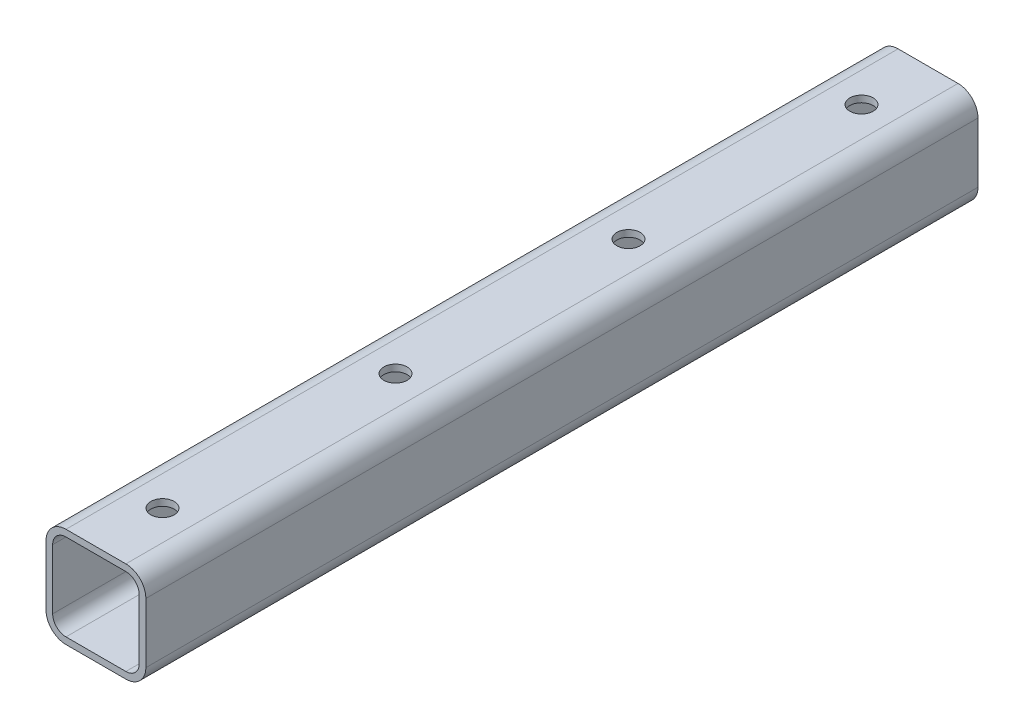
ISO-10303-21;
HEADER;
FILE_DESCRIPTION(('STEP AP214'),'2;1');
FILE_NAME('part.step','',(''),(''),'','','');
FILE_SCHEMA(('AUTOMOTIVE_DESIGN { 1 0 10303 214 1 1 1 1 }'));
ENDSEC;
DATA;
#1=APPLICATION_CONTEXT('core data for automotive mechanical design processes');
#2=APPLICATION_PROTOCOL_DEFINITION('international standard','automotive_design',2000,#1);
#3=PRODUCT_CONTEXT('',#1,'mechanical');
#4=PRODUCT('Part','Part','',(#3));
#5=PRODUCT_RELATED_PRODUCT_CATEGORY('part','',(#4));
#6=PRODUCT_DEFINITION_FORMATION('','',#4);
#7=PRODUCT_DEFINITION_CONTEXT('part definition',#1,'design');
#8=PRODUCT_DEFINITION('design','',#6,#7);
#9=PRODUCT_DEFINITION_SHAPE('','',#8);
#10=(LENGTH_UNIT() NAMED_UNIT(*) SI_UNIT(.MILLI.,.METRE.));
#11=(NAMED_UNIT(*) PLANE_ANGLE_UNIT() SI_UNIT($,.RADIAN.));
#12=(NAMED_UNIT(*) SI_UNIT($,.STERADIAN.) SOLID_ANGLE_UNIT());
#13=UNCERTAINTY_MEASURE_WITH_UNIT(LENGTH_MEASURE(1.E-05),#10,'distance_accuracy_value','');
#14=(GEOMETRIC_REPRESENTATION_CONTEXT(3) GLOBAL_UNCERTAINTY_ASSIGNED_CONTEXT((#13)) GLOBAL_UNIT_ASSIGNED_CONTEXT((#10,
#11,#12)) REPRESENTATION_CONTEXT('',''));
#15=CARTESIAN_POINT('',(0.,0.,0.));
#16=DIRECTION('',(0.,0.,1.));
#17=DIRECTION('',(1.,0.,0.));
#18=AXIS2_PLACEMENT_3D('',#15,#16,#17);
#19=CARTESIAN_POINT('',(9.,9.,125.));
#20=DIRECTION('',(0.,0.,-1.));
#21=DIRECTION('',(-1.,0.,0.));
#22=AXIS2_PLACEMENT_3D('',#19,#20,#21);
#23=PLANE('',#22);
#24=CARTESIAN_POINT('',(9.,9.,125.));
#25=DIRECTION('',(0.,0.,1.));
#26=DIRECTION('',(-1.,0.,0.));
#27=AXIS2_PLACEMENT_3D('',#24,#25,#26);
#28=CIRCLE('',#27,6.);
#29=CARTESIAN_POINT('',(15.,9.,125.));
#30=VERTEX_POINT('',#29);
#31=CARTESIAN_POINT('',(9.,15.,125.));
#32=VERTEX_POINT('',#31);
#33=EDGE_CURVE('E215',#30,#32,#28,.T.);
#34=ORIENTED_EDGE('',*,*,#33,.T.);
#35=DIRECTION('',(-1.,0.,0.));
#36=VECTOR('',#35,1.);
#37=CARTESIAN_POINT('',(-9.,15.,125.));
#38=LINE('',#37,#36);
#39=CARTESIAN_POINT('',(-9.,15.,125.));
#40=VERTEX_POINT('',#39);
#41=EDGE_CURVE('E218',#32,#40,#38,.T.);
#42=ORIENTED_EDGE('',*,*,#41,.T.);
#43=CARTESIAN_POINT('',(-9.,9.,125.));
#44=DIRECTION('',(0.,0.,1.));
#45=DIRECTION('',(1.,0.,0.));
#46=AXIS2_PLACEMENT_3D('',#43,#44,#45);
#47=CIRCLE('',#46,6.);
#48=CARTESIAN_POINT('',(-15.,9.,125.));
#49=VERTEX_POINT('',#48);
#50=EDGE_CURVE('E221',#40,#49,#47,.T.);
#51=ORIENTED_EDGE('',*,*,#50,.T.);
#52=DIRECTION('',(0.,-1.,0.));
#53=VECTOR('',#52,1.);
#54=CARTESIAN_POINT('',(-15.,9.,125.));
#55=LINE('',#54,#53);
#56=CARTESIAN_POINT('',(-15.,-9.,125.));
#57=VERTEX_POINT('',#56);
#58=EDGE_CURVE('E223',#49,#57,#55,.T.);
#59=ORIENTED_EDGE('',*,*,#58,.T.);
#60=CARTESIAN_POINT('',(-9.,-9.,125.));
#61=DIRECTION('',(0.,0.,1.));
#62=DIRECTION('',(-1.,0.,0.));
#63=AXIS2_PLACEMENT_3D('',#60,#61,#62);
#64=CIRCLE('',#63,6.);
#65=CARTESIAN_POINT('',(-9.,-15.,125.));
#66=VERTEX_POINT('',#65);
#67=EDGE_CURVE('E225',#57,#66,#64,.T.);
#68=ORIENTED_EDGE('',*,*,#67,.T.);
#69=DIRECTION('',(1.,0.,0.));
#70=VECTOR('',#69,1.);
#71=CARTESIAN_POINT('',(-9.,-15.,125.));
#72=LINE('',#71,#70);
#73=CARTESIAN_POINT('',(9.,-15.,125.));
#74=VERTEX_POINT('',#73);
#75=EDGE_CURVE('E227',#66,#74,#72,.T.);
#76=ORIENTED_EDGE('',*,*,#75,.T.);
#77=CARTESIAN_POINT('',(9.,-9.,125.));
#78=DIRECTION('',(0.,0.,1.));
#79=DIRECTION('',(1.,0.,0.));
#80=AXIS2_PLACEMENT_3D('',#77,#78,#79);
#81=CIRCLE('',#80,6.);
#82=CARTESIAN_POINT('',(15.,-9.,125.));
#83=VERTEX_POINT('',#82);
#84=EDGE_CURVE('E229',#74,#83,#81,.T.);
#85=ORIENTED_EDGE('',*,*,#84,.T.);
#86=DIRECTION('',(0.,1.,0.));
#87=VECTOR('',#86,1.);
#88=CARTESIAN_POINT('',(15.,9.,125.));
#89=LINE('',#88,#87);
#90=EDGE_CURVE('E231',#83,#30,#89,.T.);
#91=ORIENTED_EDGE('',*,*,#90,.T.);
#92=EDGE_LOOP('',(#34,#42,#51,#59,#68,#76,#85,#91));
#93=FACE_BOUND('',#92,.T.);
#94=CARTESIAN_POINT('',(-9.,9.,125.));
#95=DIRECTION('',(0.,0.,1.));
#96=DIRECTION('',(1.,0.,0.));
#97=AXIS2_PLACEMENT_3D('',#94,#95,#96);
#98=CIRCLE('',#97,4.);
#99=CARTESIAN_POINT('',(-9.,13.,125.));
#100=VERTEX_POINT('',#99);
#101=CARTESIAN_POINT('',(-13.,9.,125.));
#102=VERTEX_POINT('',#101);
#103=EDGE_CURVE('E148',#100,#102,#98,.T.);
#104=ORIENTED_EDGE('',*,*,#103,.F.);
#105=DIRECTION('',(-1.,0.,0.));
#106=VECTOR('',#105,1.);
#107=CARTESIAN_POINT('',(-9.,13.,125.));
#108=LINE('',#107,#106);
#109=CARTESIAN_POINT('',(9.,13.,125.));
#110=VERTEX_POINT('',#109);
#111=EDGE_CURVE('E182',#110,#100,#108,.T.);
#112=ORIENTED_EDGE('',*,*,#111,.F.);
#113=CARTESIAN_POINT('',(9.,9.,125.));
#114=DIRECTION('',(0.,0.,1.));
#115=DIRECTION('',(-1.,0.,0.));
#116=AXIS2_PLACEMENT_3D('',#113,#114,#115);
#117=CIRCLE('',#116,4.);
#118=CARTESIAN_POINT('',(13.,9.,125.));
#119=VERTEX_POINT('',#118);
#120=EDGE_CURVE('E180',#119,#110,#117,.T.);
#121=ORIENTED_EDGE('',*,*,#120,.F.);
#122=DIRECTION('',(0.,1.,0.));
#123=VECTOR('',#122,1.);
#124=CARTESIAN_POINT('',(13.,9.,125.));
#125=LINE('',#124,#123);
#126=CARTESIAN_POINT('',(13.,-9.,125.));
#127=VERTEX_POINT('',#126);
#128=EDGE_CURVE('E178',#127,#119,#125,.T.);
#129=ORIENTED_EDGE('',*,*,#128,.F.);
#130=CARTESIAN_POINT('',(9.,-9.,125.));
#131=DIRECTION('',(0.,0.,1.));
#132=DIRECTION('',(1.,0.,0.));
#133=AXIS2_PLACEMENT_3D('',#130,#131,#132);
#134=CIRCLE('',#133,4.);
#135=CARTESIAN_POINT('',(9.,-13.,125.));
#136=VERTEX_POINT('',#135);
#137=EDGE_CURVE('E176',#136,#127,#134,.T.);
#138=ORIENTED_EDGE('',*,*,#137,.F.);
#139=DIRECTION('',(1.,0.,0.));
#140=VECTOR('',#139,1.);
#141=CARTESIAN_POINT('',(-9.,-13.,125.));
#142=LINE('',#141,#140);
#143=CARTESIAN_POINT('',(-9.,-13.,125.));
#144=VERTEX_POINT('',#143);
#145=EDGE_CURVE('E171',#144,#136,#142,.T.);
#146=ORIENTED_EDGE('',*,*,#145,.F.);
#147=CARTESIAN_POINT('',(-9.,-9.,125.));
#148=DIRECTION('',(0.,0.,1.));
#149=DIRECTION('',(-1.,0.,0.));
#150=AXIS2_PLACEMENT_3D('',#147,#148,#149);
#151=CIRCLE('',#150,4.);
#152=CARTESIAN_POINT('',(-13.,-9.,125.));
#153=VERTEX_POINT('',#152);
#154=EDGE_CURVE('E169',#153,#144,#151,.T.);
#155=ORIENTED_EDGE('',*,*,#154,.F.);
#156=DIRECTION('',(0.,-1.,0.));
#157=VECTOR('',#156,1.);
#158=CARTESIAN_POINT('',(-13.,9.,125.));
#159=LINE('',#158,#157);
#160=EDGE_CURVE('E156',#102,#153,#159,.T.);
#161=ORIENTED_EDGE('',*,*,#160,.F.);
#162=EDGE_LOOP('',(#104,#112,#121,#129,#138,#146,#155,#161));
#163=FACE_BOUND('',#162,.T.);
#164=ADVANCED_FACE('F33',(#93,#163),#23,.F.);
#165=CARTESIAN_POINT('',(9.,9.,-125.));
#166=DIRECTION('',(0.,0.,-1.));
#167=DIRECTION('',(-1.,0.,0.));
#168=AXIS2_PLACEMENT_3D('',#165,#166,#167);
#169=PLANE('',#168);
#170=CARTESIAN_POINT('',(9.,9.,-125.));
#171=DIRECTION('',(0.,0.,1.));
#172=DIRECTION('',(-1.,0.,0.));
#173=AXIS2_PLACEMENT_3D('',#170,#171,#172);
#174=CIRCLE('',#173,6.);
#175=CARTESIAN_POINT('',(15.,9.,-125.));
#176=VERTEX_POINT('',#175);
#177=CARTESIAN_POINT('',(9.,15.,-125.));
#178=VERTEX_POINT('',#177);
#179=EDGE_CURVE('E164',#176,#178,#174,.T.);
#180=ORIENTED_EDGE('',*,*,#179,.F.);
#181=DIRECTION('',(0.,1.,0.));
#182=VECTOR('',#181,1.);
#183=CARTESIAN_POINT('',(15.,9.,-125.));
#184=LINE('',#183,#182);
#185=CARTESIAN_POINT('',(15.,-9.,-125.));
#186=VERTEX_POINT('',#185);
#187=EDGE_CURVE('E219',#186,#176,#184,.T.);
#188=ORIENTED_EDGE('',*,*,#187,.F.);
#189=CARTESIAN_POINT('',(9.,-9.,-125.));
#190=DIRECTION('',(0.,0.,1.));
#191=DIRECTION('',(1.,0.,0.));
#192=AXIS2_PLACEMENT_3D('',#189,#190,#191);
#193=CIRCLE('',#192,6.);
#194=CARTESIAN_POINT('',(9.,-15.,-125.));
#195=VERTEX_POINT('',#194);
#196=EDGE_CURVE('E246',#195,#186,#193,.T.);
#197=ORIENTED_EDGE('',*,*,#196,.F.);
#198=DIRECTION('',(1.,0.,0.));
#199=VECTOR('',#198,1.);
#200=CARTESIAN_POINT('',(-9.,-15.,-125.));
#201=LINE('',#200,#199);
#202=CARTESIAN_POINT('',(-9.,-15.,-125.));
#203=VERTEX_POINT('',#202);
#204=EDGE_CURVE('E244',#203,#195,#201,.T.);
#205=ORIENTED_EDGE('',*,*,#204,.F.);
#206=CARTESIAN_POINT('',(-9.,-9.,-125.));
#207=DIRECTION('',(0.,0.,1.));
#208=DIRECTION('',(-1.,0.,0.));
#209=AXIS2_PLACEMENT_3D('',#206,#207,#208);
#210=CIRCLE('',#209,6.);
#211=CARTESIAN_POINT('',(-15.,-9.,-125.));
#212=VERTEX_POINT('',#211);
#213=EDGE_CURVE('E242',#212,#203,#210,.T.);
#214=ORIENTED_EDGE('',*,*,#213,.F.);
#215=DIRECTION('',(0.,-1.,0.));
#216=VECTOR('',#215,1.);
#217=CARTESIAN_POINT('',(-15.,9.,-125.));
#218=LINE('',#217,#216);
#219=CARTESIAN_POINT('',(-15.,9.,-125.));
#220=VERTEX_POINT('',#219);
#221=EDGE_CURVE('E240',#220,#212,#218,.T.);
#222=ORIENTED_EDGE('',*,*,#221,.F.);
#223=CARTESIAN_POINT('',(-9.,9.,-125.));
#224=DIRECTION('',(0.,0.,1.));
#225=DIRECTION('',(1.,0.,0.));
#226=AXIS2_PLACEMENT_3D('',#223,#224,#225);
#227=CIRCLE('',#226,6.);
#228=CARTESIAN_POINT('',(-9.,15.,-125.));
#229=VERTEX_POINT('',#228);
#230=EDGE_CURVE('E238',#229,#220,#227,.T.);
#231=ORIENTED_EDGE('',*,*,#230,.F.);
#232=DIRECTION('',(-1.,0.,0.));
#233=VECTOR('',#232,1.);
#234=CARTESIAN_POINT('',(-9.,15.,-125.));
#235=LINE('',#234,#233);
#236=EDGE_CURVE('E236',#178,#229,#235,.T.);
#237=ORIENTED_EDGE('',*,*,#236,.F.);
#238=EDGE_LOOP('',(#180,#188,#197,#205,#214,#222,#231,#237));
#239=FACE_BOUND('',#238,.T.);
#240=DIRECTION('',(-1.,0.,0.));
#241=VECTOR('',#240,1.);
#242=CARTESIAN_POINT('',(-9.,13.,-125.));
#243=LINE('',#242,#241);
#244=CARTESIAN_POINT('',(9.,13.,-125.));
#245=VERTEX_POINT('',#244);
#246=CARTESIAN_POINT('',(-9.,13.,-125.));
#247=VERTEX_POINT('',#246);
#248=EDGE_CURVE('E157',#245,#247,#243,.T.);
#249=ORIENTED_EDGE('',*,*,#248,.T.);
#250=CARTESIAN_POINT('',(-9.,9.,-125.));
#251=DIRECTION('',(0.,0.,1.));
#252=DIRECTION('',(1.,0.,0.));
#253=AXIS2_PLACEMENT_3D('',#250,#251,#252);
#254=CIRCLE('',#253,4.);
#255=CARTESIAN_POINT('',(-13.,9.,-125.));
#256=VERTEX_POINT('',#255);
#257=EDGE_CURVE('E58',#247,#256,#254,.T.);
#258=ORIENTED_EDGE('',*,*,#257,.T.);
#259=DIRECTION('',(0.,-1.,0.));
#260=VECTOR('',#259,1.);
#261=CARTESIAN_POINT('',(-13.,9.,-125.));
#262=LINE('',#261,#260);
#263=CARTESIAN_POINT('',(-13.,-9.,-125.));
#264=VERTEX_POINT('',#263);
#265=EDGE_CURVE('E163',#256,#264,#262,.T.);
#266=ORIENTED_EDGE('',*,*,#265,.T.);
#267=CARTESIAN_POINT('',(-9.,-9.,-125.));
#268=DIRECTION('',(0.,0.,1.));
#269=DIRECTION('',(-1.,0.,0.));
#270=AXIS2_PLACEMENT_3D('',#267,#268,#269);
#271=CIRCLE('',#270,4.);
#272=CARTESIAN_POINT('',(-9.,-13.,-125.));
#273=VERTEX_POINT('',#272);
#274=EDGE_CURVE('E187',#264,#273,#271,.T.);
#275=ORIENTED_EDGE('',*,*,#274,.T.);
#276=DIRECTION('',(1.,0.,0.));
#277=VECTOR('',#276,1.);
#278=CARTESIAN_POINT('',(-9.,-13.,-125.));
#279=LINE('',#278,#277);
#280=CARTESIAN_POINT('',(9.,-13.,-125.));
#281=VERTEX_POINT('',#280);
#282=EDGE_CURVE('E190',#273,#281,#279,.T.);
#283=ORIENTED_EDGE('',*,*,#282,.T.);
#284=CARTESIAN_POINT('',(9.,-9.,-125.));
#285=DIRECTION('',(0.,0.,1.));
#286=DIRECTION('',(1.,0.,0.));
#287=AXIS2_PLACEMENT_3D('',#284,#285,#286);
#288=CIRCLE('',#287,4.);
#289=CARTESIAN_POINT('',(13.,-9.,-125.));
#290=VERTEX_POINT('',#289);
#291=EDGE_CURVE('E193',#281,#290,#288,.T.);
#292=ORIENTED_EDGE('',*,*,#291,.T.);
#293=DIRECTION('',(0.,1.,0.));
#294=VECTOR('',#293,1.);
#295=CARTESIAN_POINT('',(13.,9.,-125.));
#296=LINE('',#295,#294);
#297=CARTESIAN_POINT('',(13.,9.,-125.));
#298=VERTEX_POINT('',#297);
#299=EDGE_CURVE('E196',#290,#298,#296,.T.);
#300=ORIENTED_EDGE('',*,*,#299,.T.);
#301=CARTESIAN_POINT('',(9.,9.,-125.));
#302=DIRECTION('',(0.,0.,1.));
#303=DIRECTION('',(-1.,0.,0.));
#304=AXIS2_PLACEMENT_3D('',#301,#302,#303);
#305=CIRCLE('',#304,4.);
#306=EDGE_CURVE('E199',#298,#245,#305,.T.);
#307=ORIENTED_EDGE('',*,*,#306,.T.);
#308=EDGE_LOOP('',(#249,#258,#266,#275,#283,#292,#300,#307));
#309=FACE_BOUND('',#308,.T.);
#310=ADVANCED_FACE('F321',(#239,#309),#169,.T.);
#311=CARTESIAN_POINT('',(9.,9.,125.));
#312=DIRECTION('',(0.,0.,-1.));
#313=DIRECTION('',(-1.,0.,0.));
#314=AXIS2_PLACEMENT_3D('',#311,#312,#313);
#315=CYLINDRICAL_SURFACE('',#314,6.);
#316=ORIENTED_EDGE('',*,*,#179,.T.);
#317=DIRECTION('',(0.,0.,-1.));
#318=VECTOR('',#317,1.);
#319=CARTESIAN_POINT('',(9.,15.,125.));
#320=LINE('',#319,#318);
#321=EDGE_CURVE('E11',#32,#178,#320,.T.);
#322=ORIENTED_EDGE('',*,*,#321,.F.);
#323=ORIENTED_EDGE('',*,*,#33,.F.);
#324=DIRECTION('',(0.,0.,-1.));
#325=VECTOR('',#324,1.);
#326=CARTESIAN_POINT('',(15.,9.,125.));
#327=LINE('',#326,#325);
#328=EDGE_CURVE('E233',#30,#176,#327,.T.);
#329=ORIENTED_EDGE('',*,*,#328,.T.);
#330=EDGE_LOOP('',(#316,#322,#323,#329));
#331=FACE_BOUND('',#330,.T.);
#332=ADVANCED_FACE('F35',(#331),#315,.T.);
#333=CARTESIAN_POINT('',(-9.,15.,125.));
#334=DIRECTION('',(0.,-1.,0.));
#335=DIRECTION('',(0.,0.,-1.));
#336=AXIS2_PLACEMENT_3D('',#333,#334,#335);
#337=PLANE('',#336);
#338=CARTESIAN_POINT('',(0.,15.,-105.));
#339=DIRECTION('',(0.,1.,0.));
#340=DIRECTION('',(0.,0.,1.));
#341=AXIS2_PLACEMENT_3D('',#338,#339,#340);
#342=CIRCLE('',#341,3.5);
#343=CARTESIAN_POINT('',(0.,15.,-101.5));
#344=VERTEX_POINT('',#343);
#345=EDGE_CURVE('E272',#344,#344,#342,.T.);
#346=ORIENTED_EDGE('',*,*,#345,.F.);
#347=EDGE_LOOP('',(#346));
#348=FACE_BOUND('',#347,.T.);
#349=CARTESIAN_POINT('',(0.,15.,-35.));
#350=DIRECTION('',(0.,1.,0.));
#351=DIRECTION('',(0.,0.,1.));
#352=AXIS2_PLACEMENT_3D('',#349,#350,#351);
#353=CIRCLE('',#352,3.5);
#354=CARTESIAN_POINT('',(0.,15.,-31.5));
#355=VERTEX_POINT('',#354);
#356=EDGE_CURVE('E366',#355,#355,#353,.T.);
#357=ORIENTED_EDGE('',*,*,#356,.F.);
#358=EDGE_LOOP('',(#357));
#359=FACE_BOUND('',#358,.T.);
#360=CARTESIAN_POINT('',(0.,15.,35.));
#361=DIRECTION('',(0.,1.,0.));
#362=DIRECTION('',(0.,0.,-1.));
#363=AXIS2_PLACEMENT_3D('',#360,#361,#362);
#364=CIRCLE('',#363,3.5);
#365=CARTESIAN_POINT('',(0.,15.,31.5));
#366=VERTEX_POINT('',#365);
#367=EDGE_CURVE('E370',#366,#366,#364,.T.);
#368=ORIENTED_EDGE('',*,*,#367,.F.);
#369=EDGE_LOOP('',(#368));
#370=FACE_BOUND('',#369,.T.);
#371=CARTESIAN_POINT('',(0.,15.,105.));
#372=DIRECTION('',(0.,1.,0.));
#373=DIRECTION('',(0.,0.,-1.));
#374=AXIS2_PLACEMENT_3D('',#371,#372,#373);
#375=CIRCLE('',#374,3.5);
#376=CARTESIAN_POINT('',(0.,15.,101.5));
#377=VERTEX_POINT('',#376);
#378=EDGE_CURVE('E374',#377,#377,#375,.T.);
#379=ORIENTED_EDGE('',*,*,#378,.F.);
#380=EDGE_LOOP('',(#379));
#381=FACE_BOUND('',#380,.T.);
#382=ORIENTED_EDGE('',*,*,#236,.T.);
#383=DIRECTION('',(0.,0.,-1.));
#384=VECTOR('',#383,1.);
#385=CARTESIAN_POINT('',(-9.,15.,125.));
#386=LINE('',#385,#384);
#387=EDGE_CURVE('E42',#40,#229,#386,.T.);
#388=ORIENTED_EDGE('',*,*,#387,.F.);
#389=ORIENTED_EDGE('',*,*,#41,.F.);
#390=ORIENTED_EDGE('',*,*,#321,.T.);
#391=EDGE_LOOP('',(#382,#388,#389,#390));
#392=FACE_BOUND('',#391,.T.);
#393=ADVANCED_FACE('F352',(#348,#359,#370,#381,#392),#337,.F.);
#394=CARTESIAN_POINT('',(-9.,9.,125.));
#395=DIRECTION('',(0.,0.,-1.));
#396=DIRECTION('',(-1.,0.,0.));
#397=AXIS2_PLACEMENT_3D('',#394,#395,#396);
#398=CYLINDRICAL_SURFACE('',#397,6.);
#399=ORIENTED_EDGE('',*,*,#230,.T.);
#400=DIRECTION('',(0.,0.,-1.));
#401=VECTOR('',#400,1.);
#402=CARTESIAN_POINT('',(-15.,9.,125.));
#403=LINE('',#402,#401);
#404=EDGE_CURVE('E263',#49,#220,#403,.T.);
#405=ORIENTED_EDGE('',*,*,#404,.F.);
#406=ORIENTED_EDGE('',*,*,#50,.F.);
#407=ORIENTED_EDGE('',*,*,#387,.T.);
#408=EDGE_LOOP('',(#399,#405,#406,#407));
#409=FACE_BOUND('',#408,.T.);
#410=ADVANCED_FACE('F349',(#409),#398,.T.);
#411=CARTESIAN_POINT('',(-15.,9.,125.));
#412=DIRECTION('',(1.,0.,0.));
#413=DIRECTION('',(0.,0.,-1.));
#414=AXIS2_PLACEMENT_3D('',#411,#412,#413);
#415=PLANE('',#414);
#416=ORIENTED_EDGE('',*,*,#221,.T.);
#417=DIRECTION('',(0.,0.,-1.));
#418=VECTOR('',#417,1.);
#419=CARTESIAN_POINT('',(-15.,-9.,125.));
#420=LINE('',#419,#418);
#421=EDGE_CURVE('E260',#57,#212,#420,.T.);
#422=ORIENTED_EDGE('',*,*,#421,.F.);
#423=ORIENTED_EDGE('',*,*,#58,.F.);
#424=ORIENTED_EDGE('',*,*,#404,.T.);
#425=EDGE_LOOP('',(#416,#422,#423,#424));
#426=FACE_BOUND('',#425,.T.);
#427=ADVANCED_FACE('F345',(#426),#415,.F.);
#428=CARTESIAN_POINT('',(-9.,-9.,125.));
#429=DIRECTION('',(0.,0.,-1.));
#430=DIRECTION('',(-1.,0.,0.));
#431=AXIS2_PLACEMENT_3D('',#428,#429,#430);
#432=CYLINDRICAL_SURFACE('',#431,6.);
#433=ORIENTED_EDGE('',*,*,#213,.T.);
#434=DIRECTION('',(0.,0.,-1.));
#435=VECTOR('',#434,1.);
#436=CARTESIAN_POINT('',(-9.,-15.,125.));
#437=LINE('',#436,#435);
#438=EDGE_CURVE('E257',#66,#203,#437,.T.);
#439=ORIENTED_EDGE('',*,*,#438,.F.);
#440=ORIENTED_EDGE('',*,*,#67,.F.);
#441=ORIENTED_EDGE('',*,*,#421,.T.);
#442=EDGE_LOOP('',(#433,#439,#440,#441));
#443=FACE_BOUND('',#442,.T.);
#444=ADVANCED_FACE('F342',(#443),#432,.T.);
#445=CARTESIAN_POINT('',(-9.,-15.,125.));
#446=DIRECTION('',(0.,1.,0.));
#447=DIRECTION('',(0.,0.,1.));
#448=AXIS2_PLACEMENT_3D('',#445,#446,#447);
#449=PLANE('',#448);
#450=CARTESIAN_POINT('',(0.,-15.,-105.));
#451=DIRECTION('',(0.,1.,0.));
#452=DIRECTION('',(0.,0.,1.));
#453=AXIS2_PLACEMENT_3D('',#450,#451,#452);
#454=CIRCLE('',#453,3.5);
#455=CARTESIAN_POINT('',(0.,-15.,-101.5));
#456=VERTEX_POINT('',#455);
#457=EDGE_CURVE('E185',#456,#456,#454,.T.);
#458=ORIENTED_EDGE('',*,*,#457,.T.);
#459=EDGE_LOOP('',(#458));
#460=FACE_BOUND('',#459,.T.);
#461=CARTESIAN_POINT('',(0.,-15.,-35.));
#462=DIRECTION('',(0.,1.,0.));
#463=DIRECTION('',(0.,0.,1.));
#464=AXIS2_PLACEMENT_3D('',#461,#462,#463);
#465=CIRCLE('',#464,3.5);
#466=CARTESIAN_POINT('',(0.,-15.,-31.5));
#467=VERTEX_POINT('',#466);
#468=EDGE_CURVE('E284',#467,#467,#465,.T.);
#469=ORIENTED_EDGE('',*,*,#468,.T.);
#470=EDGE_LOOP('',(#469));
#471=FACE_BOUND('',#470,.T.);
#472=CARTESIAN_POINT('',(0.,-15.,35.));
#473=DIRECTION('',(0.,1.,0.));
#474=DIRECTION('',(0.,0.,1.));
#475=AXIS2_PLACEMENT_3D('',#472,#473,#474);
#476=CIRCLE('',#475,3.5);
#477=CARTESIAN_POINT('',(0.,-15.,38.5));
#478=VERTEX_POINT('',#477);
#479=EDGE_CURVE('E280',#478,#478,#476,.T.);
#480=ORIENTED_EDGE('',*,*,#479,.T.);
#481=EDGE_LOOP('',(#480));
#482=FACE_BOUND('',#481,.T.);
#483=CARTESIAN_POINT('',(0.,-15.,105.));
#484=DIRECTION('',(0.,1.,0.));
#485=DIRECTION('',(0.,0.,1.));
#486=AXIS2_PLACEMENT_3D('',#483,#484,#485);
#487=CIRCLE('',#486,3.5);
#488=CARTESIAN_POINT('',(0.,-15.,108.5));
#489=VERTEX_POINT('',#488);
#490=EDGE_CURVE('E276',#489,#489,#487,.T.);
#491=ORIENTED_EDGE('',*,*,#490,.T.);
#492=EDGE_LOOP('',(#491));
#493=FACE_BOUND('',#492,.T.);
#494=ORIENTED_EDGE('',*,*,#204,.T.);
#495=DIRECTION('',(0.,0.,-1.));
#496=VECTOR('',#495,1.);
#497=CARTESIAN_POINT('',(9.,-15.,125.));
#498=LINE('',#497,#496);
#499=EDGE_CURVE('E254',#74,#195,#498,.T.);
#500=ORIENTED_EDGE('',*,*,#499,.F.);
#501=ORIENTED_EDGE('',*,*,#75,.F.);
#502=ORIENTED_EDGE('',*,*,#438,.T.);
#503=EDGE_LOOP('',(#494,#500,#501,#502));
#504=FACE_BOUND('',#503,.T.);
#505=ADVANCED_FACE('F301',(#460,#471,#482,#493,#504),#449,.F.);
#506=CARTESIAN_POINT('',(9.,-9.,125.));
#507=DIRECTION('',(0.,0.,-1.));
#508=DIRECTION('',(-1.,0.,0.));
#509=AXIS2_PLACEMENT_3D('',#506,#507,#508);
#510=CYLINDRICAL_SURFACE('',#509,6.);
#511=ORIENTED_EDGE('',*,*,#196,.T.);
#512=DIRECTION('',(0.,0.,-1.));
#513=VECTOR('',#512,1.);
#514=CARTESIAN_POINT('',(15.,-9.,125.));
#515=LINE('',#514,#513);
#516=EDGE_CURVE('E251',#83,#186,#515,.T.);
#517=ORIENTED_EDGE('',*,*,#516,.F.);
#518=ORIENTED_EDGE('',*,*,#84,.F.);
#519=ORIENTED_EDGE('',*,*,#499,.T.);
#520=EDGE_LOOP('',(#511,#517,#518,#519));
#521=FACE_BOUND('',#520,.T.);
#522=ADVANCED_FACE('F335',(#521),#510,.T.);
#523=CARTESIAN_POINT('',(15.,9.,125.));
#524=DIRECTION('',(-1.,0.,0.));
#525=DIRECTION('',(0.,0.,1.));
#526=AXIS2_PLACEMENT_3D('',#523,#524,#525);
#527=PLANE('',#526);
#528=ORIENTED_EDGE('',*,*,#187,.T.);
#529=ORIENTED_EDGE('',*,*,#328,.F.);
#530=ORIENTED_EDGE('',*,*,#90,.F.);
#531=ORIENTED_EDGE('',*,*,#516,.T.);
#532=EDGE_LOOP('',(#528,#529,#530,#531));
#533=FACE_BOUND('',#532,.T.);
#534=ADVANCED_FACE('F332',(#533),#527,.F.);
#535=CARTESIAN_POINT('',(-9.,9.,125.));
#536=DIRECTION('',(0.,0.,-1.));
#537=DIRECTION('',(-1.,0.,0.));
#538=AXIS2_PLACEMENT_3D('',#535,#536,#537);
#539=CYLINDRICAL_SURFACE('',#538,4.);
#540=ORIENTED_EDGE('',*,*,#257,.F.);
#541=DIRECTION('',(0.,0.,-1.));
#542=VECTOR('',#541,1.);
#543=CARTESIAN_POINT('',(-9.,13.,125.));
#544=LINE('',#543,#542);
#545=EDGE_CURVE('E152',#100,#247,#544,.T.);
#546=ORIENTED_EDGE('',*,*,#545,.F.);
#547=ORIENTED_EDGE('',*,*,#103,.T.);
#548=DIRECTION('',(0.,0.,-1.));
#549=VECTOR('',#548,1.);
#550=CARTESIAN_POINT('',(-13.,9.,125.));
#551=LINE('',#550,#549);
#552=EDGE_CURVE('E151',#102,#256,#551,.T.);
#553=ORIENTED_EDGE('',*,*,#552,.T.);
#554=EDGE_LOOP('',(#540,#546,#547,#553));
#555=FACE_BOUND('',#554,.T.);
#556=ADVANCED_FACE('F150',(#555),#539,.F.);
#557=CARTESIAN_POINT('',(-13.,9.,125.));
#558=DIRECTION('',(1.,0.,0.));
#559=DIRECTION('',(0.,1.,0.));
#560=AXIS2_PLACEMENT_3D('',#557,#558,#559);
#561=PLANE('',#560);
#562=ORIENTED_EDGE('',*,*,#265,.F.);
#563=ORIENTED_EDGE('',*,*,#552,.F.);
#564=ORIENTED_EDGE('',*,*,#160,.T.);
#565=DIRECTION('',(0.,0.,-1.));
#566=VECTOR('',#565,1.);
#567=CARTESIAN_POINT('',(-13.,-9.,125.));
#568=LINE('',#567,#566);
#569=EDGE_CURVE('E165',#153,#264,#568,.T.);
#570=ORIENTED_EDGE('',*,*,#569,.T.);
#571=EDGE_LOOP('',(#562,#563,#564,#570));
#572=FACE_BOUND('',#571,.T.);
#573=ADVANCED_FACE('F160',(#572),#561,.T.);
#574=CARTESIAN_POINT('',(-9.,-9.,125.));
#575=DIRECTION('',(0.,0.,-1.));
#576=DIRECTION('',(-1.,0.,0.));
#577=AXIS2_PLACEMENT_3D('',#574,#575,#576);
#578=CYLINDRICAL_SURFACE('',#577,4.);
#579=ORIENTED_EDGE('',*,*,#274,.F.);
#580=ORIENTED_EDGE('',*,*,#569,.F.);
#581=ORIENTED_EDGE('',*,*,#154,.T.);
#582=DIRECTION('',(0.,0.,-1.));
#583=VECTOR('',#582,1.);
#584=CARTESIAN_POINT('',(-9.,-13.,125.));
#585=LINE('',#584,#583);
#586=EDGE_CURVE('E212',#144,#273,#585,.T.);
#587=ORIENTED_EDGE('',*,*,#586,.T.);
#588=EDGE_LOOP('',(#579,#580,#581,#587));
#589=FACE_BOUND('',#588,.T.);
#590=ADVANCED_FACE('F421',(#589),#578,.F.);
#591=CARTESIAN_POINT('',(-9.,-13.,125.));
#592=DIRECTION('',(0.,1.,0.));
#593=DIRECTION('',(-1.,0.,0.));
#594=AXIS2_PLACEMENT_3D('',#591,#592,#593);
#595=PLANE('',#594);
#596=CARTESIAN_POINT('',(0.,-13.,-105.));
#597=DIRECTION('',(0.,1.,0.));
#598=DIRECTION('',(-1.,0.,0.));
#599=AXIS2_PLACEMENT_3D('',#596,#597,#598);
#600=CIRCLE('',#599,3.5);
#601=CARTESIAN_POINT('',(-3.5,-13.,-105.));
#602=VERTEX_POINT('',#601);
#603=EDGE_CURVE('E296',#602,#602,#600,.T.);
#604=ORIENTED_EDGE('',*,*,#603,.F.);
#605=EDGE_LOOP('',(#604));
#606=FACE_BOUND('',#605,.T.);
#607=CARTESIAN_POINT('',(0.,-13.,-35.));
#608=DIRECTION('',(0.,1.,0.));
#609=DIRECTION('',(-1.,0.,0.));
#610=AXIS2_PLACEMENT_3D('',#607,#608,#609);
#611=CIRCLE('',#610,3.5);
#612=CARTESIAN_POINT('',(-3.5,-13.,-35.));
#613=VERTEX_POINT('',#612);
#614=EDGE_CURVE('E279',#613,#613,#611,.T.);
#615=ORIENTED_EDGE('',*,*,#614,.F.);
#616=EDGE_LOOP('',(#615));
#617=FACE_BOUND('',#616,.T.);
#618=CARTESIAN_POINT('',(0.,-13.,35.));
#619=DIRECTION('',(0.,1.,0.));
#620=DIRECTION('',(-1.,0.,0.));
#621=AXIS2_PLACEMENT_3D('',#618,#619,#620);
#622=CIRCLE('',#621,3.5);
#623=CARTESIAN_POINT('',(-3.5,-13.,35.));
#624=VERTEX_POINT('',#623);
#625=EDGE_CURVE('E275',#624,#624,#622,.T.);
#626=ORIENTED_EDGE('',*,*,#625,.F.);
#627=EDGE_LOOP('',(#626));
#628=FACE_BOUND('',#627,.T.);
#629=CARTESIAN_POINT('',(0.,-13.,105.));
#630=DIRECTION('',(0.,1.,0.));
#631=DIRECTION('',(-1.,0.,0.));
#632=AXIS2_PLACEMENT_3D('',#629,#630,#631);
#633=CIRCLE('',#632,3.5);
#634=CARTESIAN_POINT('',(-3.5,-13.,105.));
#635=VERTEX_POINT('',#634);
#636=EDGE_CURVE('E271',#635,#635,#633,.T.);
#637=ORIENTED_EDGE('',*,*,#636,.F.);
#638=EDGE_LOOP('',(#637));
#639=FACE_BOUND('',#638,.T.);
#640=ORIENTED_EDGE('',*,*,#282,.F.);
#641=ORIENTED_EDGE('',*,*,#586,.F.);
#642=ORIENTED_EDGE('',*,*,#145,.T.);
#643=DIRECTION('',(0.,0.,-1.));
#644=VECTOR('',#643,1.);
#645=CARTESIAN_POINT('',(9.,-13.,125.));
#646=LINE('',#645,#644);
#647=EDGE_CURVE('E210',#136,#281,#646,.T.);
#648=ORIENTED_EDGE('',*,*,#647,.T.);
#649=EDGE_LOOP('',(#640,#641,#642,#648));
#650=FACE_BOUND('',#649,.T.);
#651=ADVANCED_FACE('F418',(#606,#617,#628,#639,#650),#595,.T.);
#652=CARTESIAN_POINT('',(9.,-9.,125.));
#653=DIRECTION('',(0.,0.,-1.));
#654=DIRECTION('',(-1.,0.,0.));
#655=AXIS2_PLACEMENT_3D('',#652,#653,#654);
#656=CYLINDRICAL_SURFACE('',#655,4.);
#657=ORIENTED_EDGE('',*,*,#291,.F.);
#658=ORIENTED_EDGE('',*,*,#647,.F.);
#659=ORIENTED_EDGE('',*,*,#137,.T.);
#660=DIRECTION('',(0.,0.,-1.));
#661=VECTOR('',#660,1.);
#662=CARTESIAN_POINT('',(13.,-9.,125.));
#663=LINE('',#662,#661);
#664=EDGE_CURVE('E208',#127,#290,#663,.T.);
#665=ORIENTED_EDGE('',*,*,#664,.T.);
#666=EDGE_LOOP('',(#657,#658,#659,#665));
#667=FACE_BOUND('',#666,.T.);
#668=ADVANCED_FACE('F413',(#667),#656,.F.);
#669=CARTESIAN_POINT('',(13.,9.,125.));
#670=DIRECTION('',(-1.,0.,0.));
#671=DIRECTION('',(0.,0.,1.));
#672=AXIS2_PLACEMENT_3D('',#669,#670,#671);
#673=PLANE('',#672);
#674=ORIENTED_EDGE('',*,*,#299,.F.);
#675=ORIENTED_EDGE('',*,*,#664,.F.);
#676=ORIENTED_EDGE('',*,*,#128,.T.);
#677=DIRECTION('',(0.,0.,-1.));
#678=VECTOR('',#677,1.);
#679=CARTESIAN_POINT('',(13.,9.,125.));
#680=LINE('',#679,#678);
#681=EDGE_CURVE('E206',#119,#298,#680,.T.);
#682=ORIENTED_EDGE('',*,*,#681,.T.);
#683=EDGE_LOOP('',(#674,#675,#676,#682));
#684=FACE_BOUND('',#683,.T.);
#685=ADVANCED_FACE('F409',(#684),#673,.T.);
#686=CARTESIAN_POINT('',(9.,9.,125.));
#687=DIRECTION('',(0.,0.,-1.));
#688=DIRECTION('',(-1.,0.,0.));
#689=AXIS2_PLACEMENT_3D('',#686,#687,#688);
#690=CYLINDRICAL_SURFACE('',#689,4.);
#691=ORIENTED_EDGE('',*,*,#306,.F.);
#692=ORIENTED_EDGE('',*,*,#681,.F.);
#693=ORIENTED_EDGE('',*,*,#120,.T.);
#694=DIRECTION('',(0.,0.,-1.));
#695=VECTOR('',#694,1.);
#696=CARTESIAN_POINT('',(9.,13.,125.));
#697=LINE('',#696,#695);
#698=EDGE_CURVE('E50',#110,#245,#697,.T.);
#699=ORIENTED_EDGE('',*,*,#698,.T.);
#700=EDGE_LOOP('',(#691,#692,#693,#699));
#701=FACE_BOUND('',#700,.T.);
#702=ADVANCED_FACE('F406',(#701),#690,.F.);
#703=CARTESIAN_POINT('',(-9.,13.,125.));
#704=DIRECTION('',(0.,-1.,0.));
#705=DIRECTION('',(1.,0.,0.));
#706=AXIS2_PLACEMENT_3D('',#703,#704,#705);
#707=PLANE('',#706);
#708=CARTESIAN_POINT('',(0.,13.,-105.));
#709=DIRECTION('',(0.,-1.,0.));
#710=DIRECTION('',(1.,0.,0.));
#711=AXIS2_PLACEMENT_3D('',#708,#709,#710);
#712=CIRCLE('',#711,3.5);
#713=CARTESIAN_POINT('',(3.5,13.,-105.));
#714=VERTEX_POINT('',#713);
#715=EDGE_CURVE('E37',#714,#714,#712,.T.);
#716=ORIENTED_EDGE('',*,*,#715,.F.);
#717=EDGE_LOOP('',(#716));
#718=FACE_BOUND('',#717,.T.);
#719=CARTESIAN_POINT('',(0.,13.,-35.));
#720=DIRECTION('',(0.,-1.,0.));
#721=DIRECTION('',(1.,0.,0.));
#722=AXIS2_PLACEMENT_3D('',#719,#720,#721);
#723=CIRCLE('',#722,3.5);
#724=CARTESIAN_POINT('',(3.5,13.,-35.));
#725=VERTEX_POINT('',#724);
#726=EDGE_CURVE('E277',#725,#725,#723,.T.);
#727=ORIENTED_EDGE('',*,*,#726,.F.);
#728=EDGE_LOOP('',(#727));
#729=FACE_BOUND('',#728,.T.);
#730=CARTESIAN_POINT('',(0.,13.,35.));
#731=DIRECTION('',(0.,-1.,0.));
#732=DIRECTION('',(1.,0.,0.));
#733=AXIS2_PLACEMENT_3D('',#730,#731,#732);
#734=CIRCLE('',#733,3.5);
#735=CARTESIAN_POINT('',(3.5,13.,35.));
#736=VERTEX_POINT('',#735);
#737=EDGE_CURVE('E273',#736,#736,#734,.T.);
#738=ORIENTED_EDGE('',*,*,#737,.F.);
#739=EDGE_LOOP('',(#738));
#740=FACE_BOUND('',#739,.T.);
#741=CARTESIAN_POINT('',(0.,13.,105.));
#742=DIRECTION('',(0.,-1.,0.));
#743=DIRECTION('',(1.,0.,0.));
#744=AXIS2_PLACEMENT_3D('',#741,#742,#743);
#745=CIRCLE('',#744,3.5);
#746=CARTESIAN_POINT('',(3.5,13.,105.));
#747=VERTEX_POINT('',#746);
#748=EDGE_CURVE('E268',#747,#747,#745,.T.);
#749=ORIENTED_EDGE('',*,*,#748,.F.);
#750=EDGE_LOOP('',(#749));
#751=FACE_BOUND('',#750,.T.);
#752=ORIENTED_EDGE('',*,*,#248,.F.);
#753=ORIENTED_EDGE('',*,*,#698,.F.);
#754=ORIENTED_EDGE('',*,*,#111,.T.);
#755=ORIENTED_EDGE('',*,*,#545,.T.);
#756=EDGE_LOOP('',(#752,#753,#754,#755));
#757=FACE_BOUND('',#756,.T.);
#758=ADVANCED_FACE('F400',(#718,#729,#740,#751,#757),#707,.T.);
#759=CARTESIAN_POINT('',(0.,-45.,105.));
#760=DIRECTION('',(0.,1.,0.));
#761=DIRECTION('',(0.,0.,1.));
#762=AXIS2_PLACEMENT_3D('',#759,#760,#761);
#763=CYLINDRICAL_SURFACE('',#762,3.5);
#764=ORIENTED_EDGE('',*,*,#748,.T.);
#765=EDGE_LOOP('',(#764));
#766=FACE_BOUND('',#765,.T.);
#767=ORIENTED_EDGE('',*,*,#378,.T.);
#768=EDGE_LOOP('',(#767));
#769=FACE_BOUND('',#768,.T.);
#770=ADVANCED_FACE('F439',(#766,#769),#763,.F.);
#771=CARTESIAN_POINT('',(0.,-45.,35.));
#772=DIRECTION('',(0.,1.,0.));
#773=DIRECTION('',(0.,0.,1.));
#774=AXIS2_PLACEMENT_3D('',#771,#772,#773);
#775=CYLINDRICAL_SURFACE('',#774,3.5);
#776=ORIENTED_EDGE('',*,*,#737,.T.);
#777=EDGE_LOOP('',(#776));
#778=FACE_BOUND('',#777,.T.);
#779=ORIENTED_EDGE('',*,*,#367,.T.);
#780=EDGE_LOOP('',(#779));
#781=FACE_BOUND('',#780,.T.);
#782=ADVANCED_FACE('F443',(#778,#781),#775,.F.);
#783=CARTESIAN_POINT('',(0.,-45.,-35.));
#784=DIRECTION('',(0.,1.,0.));
#785=DIRECTION('',(0.,0.,1.));
#786=AXIS2_PLACEMENT_3D('',#783,#784,#785);
#787=CYLINDRICAL_SURFACE('',#786,3.5);
#788=ORIENTED_EDGE('',*,*,#726,.T.);
#789=EDGE_LOOP('',(#788));
#790=FACE_BOUND('',#789,.T.);
#791=ORIENTED_EDGE('',*,*,#356,.T.);
#792=EDGE_LOOP('',(#791));
#793=FACE_BOUND('',#792,.T.);
#794=ADVANCED_FACE('F316',(#790,#793),#787,.F.);
#795=CARTESIAN_POINT('',(0.,-45.,-105.));
#796=DIRECTION('',(0.,1.,0.));
#797=DIRECTION('',(0.,0.,1.));
#798=AXIS2_PLACEMENT_3D('',#795,#796,#797);
#799=CYLINDRICAL_SURFACE('',#798,3.5);
#800=ORIENTED_EDGE('',*,*,#715,.T.);
#801=EDGE_LOOP('',(#800));
#802=FACE_BOUND('',#801,.T.);
#803=ORIENTED_EDGE('',*,*,#345,.T.);
#804=EDGE_LOOP('',(#803));
#805=FACE_BOUND('',#804,.T.);
#806=ADVANCED_FACE('F309',(#802,#805),#799,.F.);
#807=ORIENTED_EDGE('',*,*,#636,.T.);
#808=EDGE_LOOP('',(#807));
#809=FACE_BOUND('',#808,.T.);
#810=ORIENTED_EDGE('',*,*,#490,.F.);
#811=EDGE_LOOP('',(#810));
#812=FACE_BOUND('',#811,.T.);
#813=ADVANCED_FACE('F318',(#809,#812),#763,.F.);
#814=ORIENTED_EDGE('',*,*,#625,.T.);
#815=EDGE_LOOP('',(#814));
#816=FACE_BOUND('',#815,.T.);
#817=ORIENTED_EDGE('',*,*,#479,.F.);
#818=EDGE_LOOP('',(#817));
#819=FACE_BOUND('',#818,.T.);
#820=ADVANCED_FACE('F313',(#816,#819),#775,.F.);
#821=ORIENTED_EDGE('',*,*,#614,.T.);
#822=EDGE_LOOP('',(#821));
#823=FACE_BOUND('',#822,.T.);
#824=ORIENTED_EDGE('',*,*,#468,.F.);
#825=EDGE_LOOP('',(#824));
#826=FACE_BOUND('',#825,.T.);
#827=ADVANCED_FACE('F306',(#823,#826),#787,.F.);
#828=ORIENTED_EDGE('',*,*,#603,.T.);
#829=EDGE_LOOP('',(#828));
#830=FACE_BOUND('',#829,.T.);
#831=ORIENTED_EDGE('',*,*,#457,.F.);
#832=EDGE_LOOP('',(#831));
#833=FACE_BOUND('',#832,.T.);
#834=ADVANCED_FACE('F304',(#830,#833),#799,.F.);
#835=CLOSED_SHELL('',(#164,#310,#332,#393,#410,#427,#444,#505,#522,#534,#556,#573,#590,#651,
#668,#685,#702,#758,#770,#782,#794,#806,#813,#820,#827,#834));
#836=MANIFOLD_SOLID_BREP('B2',#835);
#837=ADVANCED_BREP_SHAPE_REPRESENTATION('',(#18,#836),#14);
#838=SHAPE_DEFINITION_REPRESENTATION(#9,#837);
ENDSEC;
END-ISO-10303-21;
